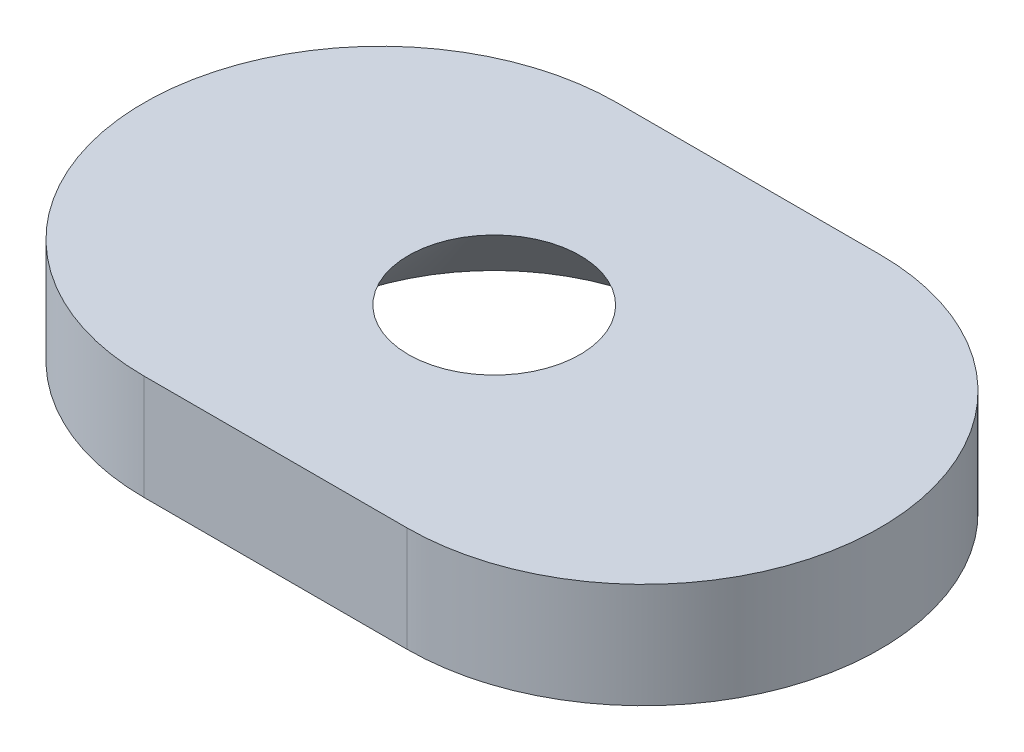
ISO-10303-21;
HEADER;
FILE_DESCRIPTION(('STEP AP214'),'2;1');
FILE_NAME('part.step','',(''),(''),'','','');
FILE_SCHEMA(('AUTOMOTIVE_DESIGN { 1 0 10303 214 1 1 1 1 }'));
ENDSEC;
DATA;
#1=APPLICATION_CONTEXT('core data for automotive mechanical design processes');
#2=APPLICATION_PROTOCOL_DEFINITION('international standard','automotive_design',2000,#1);
#3=PRODUCT_CONTEXT('',#1,'mechanical');
#4=PRODUCT('Part','Part','',(#3));
#5=PRODUCT_RELATED_PRODUCT_CATEGORY('part','',(#4));
#6=PRODUCT_DEFINITION_FORMATION('','',#4);
#7=PRODUCT_DEFINITION_CONTEXT('part definition',#1,'design');
#8=PRODUCT_DEFINITION('design','',#6,#7);
#9=PRODUCT_DEFINITION_SHAPE('','',#8);
#10=(LENGTH_UNIT() NAMED_UNIT(*) SI_UNIT(.MILLI.,.METRE.));
#11=(NAMED_UNIT(*) PLANE_ANGLE_UNIT() SI_UNIT($,.RADIAN.));
#12=(NAMED_UNIT(*) SI_UNIT($,.STERADIAN.) SOLID_ANGLE_UNIT());
#13=UNCERTAINTY_MEASURE_WITH_UNIT(LENGTH_MEASURE(1.E-05),#10,'distance_accuracy_value','');
#14=(GEOMETRIC_REPRESENTATION_CONTEXT(3) GLOBAL_UNCERTAINTY_ASSIGNED_CONTEXT((#13)) GLOBAL_UNIT_ASSIGNED_CONTEXT((#10,
#11,#12)) REPRESENTATION_CONTEXT('',''));
#15=CARTESIAN_POINT('',(0.,0.,0.));
#16=DIRECTION('',(0.,0.,1.));
#17=DIRECTION('',(1.,0.,0.));
#18=AXIS2_PLACEMENT_3D('',#15,#16,#17);
#19=CARTESIAN_POINT('',(-4.32432432432433,4.,0.));
#20=DIRECTION('',(0.,-1.,0.));
#21=DIRECTION('',(0.,0.,-1.));
#22=AXIS2_PLACEMENT_3D('',#19,#20,#21);
#23=CYLINDRICAL_SURFACE('',#22,9.);
#24=CARTESIAN_POINT('',(-4.32432432432433,0.,0.));
#25=DIRECTION('',(0.,1.,0.));
#26=DIRECTION('',(0.,0.,1.));
#27=AXIS2_PLACEMENT_3D('',#24,#25,#26);
#28=CIRCLE('',#27,9.);
#29=CARTESIAN_POINT('',(-4.32432432432433,0.,-9.));
#30=VERTEX_POINT('',#29);
#31=CARTESIAN_POINT('',(-4.32432432432433,0.,9.));
#32=VERTEX_POINT('',#31);
#33=EDGE_CURVE('E100',#30,#32,#28,.T.);
#34=ORIENTED_EDGE('',*,*,#33,.T.);
#35=DIRECTION('',(0.,-1.,0.));
#36=VECTOR('',#35,1.);
#37=CARTESIAN_POINT('',(-4.32432432432433,4.,9.));
#38=LINE('',#37,#36);
#39=CARTESIAN_POINT('',(-4.32432432432433,4.,9.));
#40=VERTEX_POINT('',#39);
#41=EDGE_CURVE('E42',#40,#32,#38,.T.);
#42=ORIENTED_EDGE('',*,*,#41,.F.);
#43=CARTESIAN_POINT('',(-4.32432432432433,4.,0.));
#44=DIRECTION('',(0.,1.,0.));
#45=DIRECTION('',(0.,0.,1.));
#46=AXIS2_PLACEMENT_3D('',#43,#44,#45);
#47=CIRCLE('',#46,9.);
#48=CARTESIAN_POINT('',(-4.32432432432433,4.,-9.));
#49=VERTEX_POINT('',#48);
#50=EDGE_CURVE('E86',#49,#40,#47,.T.);
#51=ORIENTED_EDGE('',*,*,#50,.F.);
#52=DIRECTION('',(0.,-1.,0.));
#53=VECTOR('',#52,1.);
#54=CARTESIAN_POINT('',(-4.32432432432433,4.,-9.));
#55=LINE('',#54,#53);
#56=EDGE_CURVE('E96',#49,#30,#55,.T.);
#57=ORIENTED_EDGE('',*,*,#56,.T.);
#58=EDGE_LOOP('',(#34,#42,#51,#57));
#59=FACE_BOUND('',#58,.T.);
#60=ADVANCED_FACE('F33',(#59),#23,.T.);
#61=CARTESIAN_POINT('',(-4.32432432432433,4.,9.));
#62=DIRECTION('',(0.,0.,-1.));
#63=DIRECTION('',(-1.,0.,0.));
#64=AXIS2_PLACEMENT_3D('',#61,#62,#63);
#65=PLANE('',#64);
#66=DIRECTION('',(1.,0.,0.));
#67=VECTOR('',#66,1.);
#68=CARTESIAN_POINT('',(-4.32432432432433,0.,9.));
#69=LINE('',#68,#67);
#70=CARTESIAN_POINT('',(5.67567567567567,0.,9.));
#71=VERTEX_POINT('',#70);
#72=EDGE_CURVE('E91',#32,#71,#69,.T.);
#73=ORIENTED_EDGE('',*,*,#72,.T.);
#74=DIRECTION('',(0.,-1.,0.));
#75=VECTOR('',#74,1.);
#76=CARTESIAN_POINT('',(5.67567567567567,4.,9.));
#77=LINE('',#76,#75);
#78=CARTESIAN_POINT('',(5.67567567567567,4.,9.));
#79=VERTEX_POINT('',#78);
#80=EDGE_CURVE('E89',#79,#71,#77,.T.);
#81=ORIENTED_EDGE('',*,*,#80,.F.);
#82=DIRECTION('',(1.,0.,0.));
#83=VECTOR('',#82,1.);
#84=CARTESIAN_POINT('',(-4.32432432432433,4.,9.));
#85=LINE('',#84,#83);
#86=EDGE_CURVE('E81',#40,#79,#85,.T.);
#87=ORIENTED_EDGE('',*,*,#86,.F.);
#88=ORIENTED_EDGE('',*,*,#41,.T.);
#89=EDGE_LOOP('',(#73,#81,#87,#88));
#90=FACE_BOUND('',#89,.T.);
#91=ADVANCED_FACE('F90',(#90),#65,.F.);
#92=CARTESIAN_POINT('',(5.67567567567567,4.,0.));
#93=DIRECTION('',(0.,-1.,0.));
#94=DIRECTION('',(0.,0.,-1.));
#95=AXIS2_PLACEMENT_3D('',#92,#93,#94);
#96=CYLINDRICAL_SURFACE('',#95,9.);
#97=CARTESIAN_POINT('',(5.67567567567567,0.,0.));
#98=DIRECTION('',(0.,1.,0.));
#99=DIRECTION('',(0.,0.,1.));
#100=AXIS2_PLACEMENT_3D('',#97,#98,#99);
#101=CIRCLE('',#100,9.);
#102=CARTESIAN_POINT('',(5.67567567567567,0.,-9.));
#103=VERTEX_POINT('',#102);
#104=EDGE_CURVE('E67',#71,#103,#101,.T.);
#105=ORIENTED_EDGE('',*,*,#104,.T.);
#106=DIRECTION('',(0.,-1.,0.));
#107=VECTOR('',#106,1.);
#108=CARTESIAN_POINT('',(5.67567567567567,4.,-9.));
#109=LINE('',#108,#107);
#110=CARTESIAN_POINT('',(5.67567567567567,4.,-9.));
#111=VERTEX_POINT('',#110);
#112=EDGE_CURVE('E92',#111,#103,#109,.T.);
#113=ORIENTED_EDGE('',*,*,#112,.F.);
#114=CARTESIAN_POINT('',(5.67567567567567,4.,0.));
#115=DIRECTION('',(0.,1.,0.));
#116=DIRECTION('',(0.,0.,1.));
#117=AXIS2_PLACEMENT_3D('',#114,#115,#116);
#118=CIRCLE('',#117,9.);
#119=EDGE_CURVE('E84',#79,#111,#118,.T.);
#120=ORIENTED_EDGE('',*,*,#119,.F.);
#121=ORIENTED_EDGE('',*,*,#80,.T.);
#122=EDGE_LOOP('',(#105,#113,#120,#121));
#123=FACE_BOUND('',#122,.T.);
#124=ADVANCED_FACE('F94',(#123),#96,.T.);
#125=CARTESIAN_POINT('',(-4.32432432432433,4.,-9.));
#126=DIRECTION('',(0.,0.,1.));
#127=DIRECTION('',(1.,0.,0.));
#128=AXIS2_PLACEMENT_3D('',#125,#126,#127);
#129=PLANE('',#128);
#130=DIRECTION('',(-1.,0.,0.));
#131=VECTOR('',#130,1.);
#132=CARTESIAN_POINT('',(-4.32432432432433,0.,-9.));
#133=LINE('',#132,#131);
#134=EDGE_CURVE('E73',#103,#30,#133,.T.);
#135=ORIENTED_EDGE('',*,*,#134,.T.);
#136=ORIENTED_EDGE('',*,*,#56,.F.);
#137=DIRECTION('',(-1.,0.,0.));
#138=VECTOR('',#137,1.);
#139=CARTESIAN_POINT('',(-4.32432432432433,4.,-9.));
#140=LINE('',#139,#138);
#141=EDGE_CURVE('E50',#111,#49,#140,.T.);
#142=ORIENTED_EDGE('',*,*,#141,.F.);
#143=ORIENTED_EDGE('',*,*,#112,.T.);
#144=EDGE_LOOP('',(#135,#136,#142,#143));
#145=FACE_BOUND('',#144,.T.);
#146=ADVANCED_FACE('F120',(#145),#129,.F.);
#147=CARTESIAN_POINT('',(-4.32432432432433,4.,0.));
#148=DIRECTION('',(0.,1.,0.));
#149=DIRECTION('',(0.,0.,1.));
#150=AXIS2_PLACEMENT_3D('',#147,#148,#149);
#151=PLANE('',#150);
#152=CARTESIAN_POINT('',(0.,4.,0.));
#153=DIRECTION('',(0.,1.,0.));
#154=DIRECTION('',(0.,0.,1.));
#155=AXIS2_PLACEMENT_3D('',#152,#153,#154);
#156=CIRCLE('',#155,3.265);
#157=CARTESIAN_POINT('',(0.,4.,3.265));
#158=VERTEX_POINT('',#157);
#159=EDGE_CURVE('E103',#158,#158,#156,.T.);
#160=ORIENTED_EDGE('',*,*,#159,.F.);
#161=EDGE_LOOP('',(#160));
#162=FACE_BOUND('',#161,.T.);
#163=ORIENTED_EDGE('',*,*,#50,.T.);
#164=ORIENTED_EDGE('',*,*,#86,.T.);
#165=ORIENTED_EDGE('',*,*,#119,.T.);
#166=ORIENTED_EDGE('',*,*,#141,.T.);
#167=EDGE_LOOP('',(#163,#164,#165,#166));
#168=FACE_BOUND('',#167,.T.);
#169=ADVANCED_FACE('F82',(#162,#168),#151,.T.);
#170=CARTESIAN_POINT('',(-4.32432432432433,0.,0.));
#171=DIRECTION('',(0.,1.,0.));
#172=DIRECTION('',(0.,0.,1.));
#173=AXIS2_PLACEMENT_3D('',#170,#171,#172);
#174=PLANE('',#173);
#175=CARTESIAN_POINT('',(0.,0.,0.));
#176=DIRECTION('',(0.,1.,0.));
#177=DIRECTION('',(0.,0.,1.));
#178=AXIS2_PLACEMENT_3D('',#175,#176,#177);
#179=CIRCLE('',#178,7.26500000000001);
#180=CARTESIAN_POINT('',(0.,0.,7.26500000000001));
#181=VERTEX_POINT('',#180);
#182=EDGE_CURVE('E11',#181,#181,#179,.T.);
#183=ORIENTED_EDGE('',*,*,#182,.T.);
#184=EDGE_LOOP('',(#183));
#185=FACE_BOUND('',#184,.T.);
#186=ORIENTED_EDGE('',*,*,#33,.F.);
#187=ORIENTED_EDGE('',*,*,#134,.F.);
#188=ORIENTED_EDGE('',*,*,#104,.F.);
#189=ORIENTED_EDGE('',*,*,#72,.F.);
#190=EDGE_LOOP('',(#186,#187,#188,#189));
#191=FACE_BOUND('',#190,.T.);
#192=ADVANCED_FACE('F111',(#185,#191),#174,.F.);
#193=CARTESIAN_POINT('',(0.,4.00000000000001,0.));
#194=DIRECTION('',(0.,-1.,0.));
#195=DIRECTION('',(0.,0.,-1.));
#196=AXIS2_PLACEMENT_3D('',#193,#194,#195);
#197=CONICAL_SURFACE('',#196,3.265,0.785398163397448);
#198=ORIENTED_EDGE('',*,*,#182,.F.);
#199=EDGE_LOOP('',(#198));
#200=FACE_BOUND('',#199,.T.);
#201=ORIENTED_EDGE('',*,*,#159,.T.);
#202=EDGE_LOOP('',(#201));
#203=FACE_BOUND('',#202,.T.);
#204=ADVANCED_FACE('F35',(#200,#203),#197,.F.);
#205=CLOSED_SHELL('',(#60,#91,#124,#146,#169,#192,#204));
#206=MANIFOLD_SOLID_BREP('B2',#205);
#207=ADVANCED_BREP_SHAPE_REPRESENTATION('',(#18,#206),#14);
#208=SHAPE_DEFINITION_REPRESENTATION(#9,#207);
ENDSEC;
END-ISO-10303-21;
